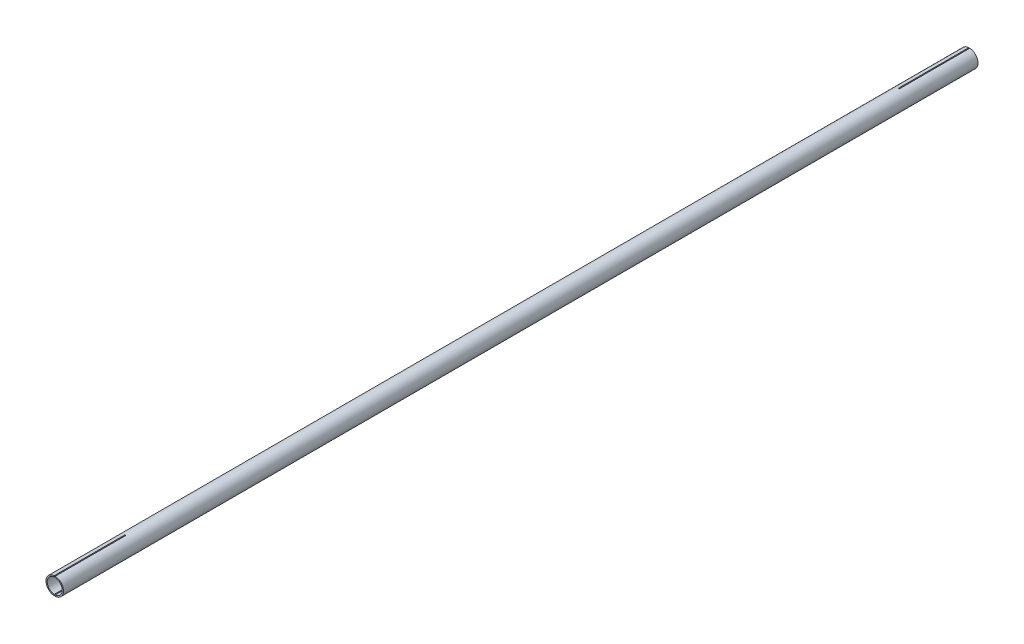
ISO-10303-21;
HEADER;
FILE_DESCRIPTION(('STEP AP214'),'2;1');
FILE_NAME('part.step','',(''),(''),'','','');
FILE_SCHEMA(('AUTOMOTIVE_DESIGN { 1 0 10303 214 1 1 1 1 }'));
ENDSEC;
DATA;
#1=APPLICATION_CONTEXT('core data for automotive mechanical design processes');
#2=APPLICATION_PROTOCOL_DEFINITION('international standard','automotive_design',2000,#1);
#3=PRODUCT_CONTEXT('',#1,'mechanical');
#4=PRODUCT('Part','Part','',(#3));
#5=PRODUCT_RELATED_PRODUCT_CATEGORY('part','',(#4));
#6=PRODUCT_DEFINITION_FORMATION('','',#4);
#7=PRODUCT_DEFINITION_CONTEXT('part definition',#1,'design');
#8=PRODUCT_DEFINITION('design','',#6,#7);
#9=PRODUCT_DEFINITION_SHAPE('','',#8);
#10=(LENGTH_UNIT() NAMED_UNIT(*) SI_UNIT(.MILLI.,.METRE.));
#11=(NAMED_UNIT(*) PLANE_ANGLE_UNIT() SI_UNIT($,.RADIAN.));
#12=(NAMED_UNIT(*) SI_UNIT($,.STERADIAN.) SOLID_ANGLE_UNIT());
#13=UNCERTAINTY_MEASURE_WITH_UNIT(LENGTH_MEASURE(1.E-05),#10,'distance_accuracy_value','');
#14=(GEOMETRIC_REPRESENTATION_CONTEXT(3) GLOBAL_UNCERTAINTY_ASSIGNED_CONTEXT((#13)) GLOBAL_UNIT_ASSIGNED_CONTEXT((#10,
#11,#12)) REPRESENTATION_CONTEXT('',''));
#15=CARTESIAN_POINT('',(0.,0.,0.));
#16=DIRECTION('',(0.,0.,1.));
#17=DIRECTION('',(1.,0.,0.));
#18=AXIS2_PLACEMENT_3D('',#15,#16,#17);
#19=CARTESIAN_POINT('',(0.,0.,1828.8));
#20=DIRECTION('',(0.,0.,1.));
#21=DIRECTION('',(1.,0.,0.));
#22=AXIS2_PLACEMENT_3D('',#19,#20,#21);
#23=PLANE('',#22);
#24=DIRECTION('',(0.,1.,0.));
#25=VECTOR('',#24,1.);
#26=CARTESIAN_POINT('',(1.04,0.,1828.8));
#27=LINE('',#26,#25);
#28=CARTESIAN_POINT('',(1.04,-17.4289988237994,1828.8));
#29=VERTEX_POINT('',#28);
#30=CARTESIAN_POINT('',(1.04,-14.9639032341164,1828.8));
#31=VERTEX_POINT('',#30);
#32=EDGE_CURVE('E224',#29,#31,#27,.T.);
#33=ORIENTED_EDGE('',*,*,#32,.F.);
#34=CARTESIAN_POINT('',(0.,0.,1828.8));
#35=DIRECTION('',(0.,0.,1.));
#36=DIRECTION('',(1.,0.,0.));
#37=AXIS2_PLACEMENT_3D('',#34,#35,#36);
#38=CIRCLE('',#37,17.46);
#39=CARTESIAN_POINT('',(1.04,17.4289988237994,1828.8));
#40=VERTEX_POINT('',#39);
#41=EDGE_CURVE('E198',#29,#40,#38,.T.);
#42=ORIENTED_EDGE('',*,*,#41,.T.);
#43=CARTESIAN_POINT('',(1.04,14.9639032341164,1828.8));
#44=VERTEX_POINT('',#43);
#45=EDGE_CURVE('E166',#44,#40,#27,.T.);
#46=ORIENTED_EDGE('',*,*,#45,.F.);
#47=CARTESIAN_POINT('',(0.,0.,1828.8));
#48=DIRECTION('',(0.,0.,1.));
#49=DIRECTION('',(1.,0.,0.));
#50=AXIS2_PLACEMENT_3D('',#47,#48,#49);
#51=CIRCLE('',#50,15.);
#52=EDGE_CURVE('E181',#31,#44,#51,.T.);
#53=ORIENTED_EDGE('',*,*,#52,.F.);
#54=EDGE_LOOP('',(#33,#42,#46,#53));
#55=FACE_BOUND('',#54,.T.);
#56=ADVANCED_FACE('F43',(#55),#23,.T.);
#57=CARTESIAN_POINT('',(0.,0.,0.));
#58=DIRECTION('',(0.,0.,1.));
#59=DIRECTION('',(1.,0.,0.));
#60=AXIS2_PLACEMENT_3D('',#57,#58,#59);
#61=PLANE('',#60);
#62=DIRECTION('',(0.,-1.,0.));
#63=VECTOR('',#62,1.);
#64=CARTESIAN_POINT('',(-1.04,-25.,0.));
#65=LINE('',#64,#63);
#66=CARTESIAN_POINT('',(-1.04,-14.9639032341164,0.));
#67=VERTEX_POINT('',#66);
#68=CARTESIAN_POINT('',(-1.04,-17.4289988237994,0.));
#69=VERTEX_POINT('',#68);
#70=EDGE_CURVE('E287',#67,#69,#65,.T.);
#71=ORIENTED_EDGE('',*,*,#70,.T.);
#72=CARTESIAN_POINT('',(0.,0.,0.));
#73=DIRECTION('',(0.,0.,1.));
#74=DIRECTION('',(1.,0.,0.));
#75=AXIS2_PLACEMENT_3D('',#72,#73,#74);
#76=CIRCLE('',#75,17.46);
#77=CARTESIAN_POINT('',(-1.04,17.4289988237994,0.));
#78=VERTEX_POINT('',#77);
#79=EDGE_CURVE('E186',#78,#69,#76,.T.);
#80=ORIENTED_EDGE('',*,*,#79,.F.);
#81=CARTESIAN_POINT('',(-1.04,14.9639032341164,0.));
#82=VERTEX_POINT('',#81);
#83=EDGE_CURVE('E291',#78,#82,#65,.T.);
#84=ORIENTED_EDGE('',*,*,#83,.T.);
#85=CARTESIAN_POINT('',(0.,0.,0.));
#86=DIRECTION('',(0.,0.,1.));
#87=DIRECTION('',(1.,0.,0.));
#88=AXIS2_PLACEMENT_3D('',#85,#86,#87);
#89=CIRCLE('',#88,15.);
#90=EDGE_CURVE('E189',#82,#67,#89,.T.);
#91=ORIENTED_EDGE('',*,*,#90,.T.);
#92=EDGE_LOOP('',(#71,#80,#84,#91));
#93=FACE_BOUND('',#92,.T.);
#94=ADVANCED_FACE('F322',(#93),#61,.F.);
#95=DIRECTION('',(0.,1.,0.));
#96=VECTOR('',#95,1.);
#97=CARTESIAN_POINT('',(1.04,-25.,0.));
#98=LINE('',#97,#96);
#99=CARTESIAN_POINT('',(1.04,14.9639032341164,0.));
#100=VERTEX_POINT('',#99);
#101=CARTESIAN_POINT('',(1.04,17.4289988237994,0.));
#102=VERTEX_POINT('',#101);
#103=EDGE_CURVE('E292',#100,#102,#98,.T.);
#104=ORIENTED_EDGE('',*,*,#103,.T.);
#105=CARTESIAN_POINT('',(1.04,-17.4289988237994,0.));
#106=VERTEX_POINT('',#105);
#107=EDGE_CURVE('E180',#106,#102,#76,.T.);
#108=ORIENTED_EDGE('',*,*,#107,.F.);
#109=CARTESIAN_POINT('',(1.04,-14.9639032341164,0.));
#110=VERTEX_POINT('',#109);
#111=EDGE_CURVE('E281',#106,#110,#98,.T.);
#112=ORIENTED_EDGE('',*,*,#111,.T.);
#113=EDGE_CURVE('E194',#110,#100,#89,.T.);
#114=ORIENTED_EDGE('',*,*,#113,.T.);
#115=EDGE_LOOP('',(#104,#108,#112,#114));
#116=FACE_BOUND('',#115,.T.);
#117=ADVANCED_FACE('F377',(#116),#61,.F.);
#118=CARTESIAN_POINT('',(0.,0.,1828.8));
#119=DIRECTION('',(0.,0.,-1.));
#120=DIRECTION('',(-1.,0.,0.));
#121=AXIS2_PLACEMENT_3D('',#118,#119,#120);
#122=CYLINDRICAL_SURFACE('',#121,17.46);
#123=CARTESIAN_POINT('',(0.,0.,1687.8));
#124=DIRECTION('',(0.,0.,1.));
#125=DIRECTION('',(1.,0.,0.));
#126=AXIS2_PLACEMENT_3D('',#123,#124,#125);
#127=CIRCLE('',#126,17.46);
#128=CARTESIAN_POINT('',(1.04,17.4289988237994,1687.8));
#129=VERTEX_POINT('',#128);
#130=CARTESIAN_POINT('',(-1.04,17.4289988237994,1687.8));
#131=VERTEX_POINT('',#130);
#132=EDGE_CURVE('E275',#129,#131,#127,.T.);
#133=ORIENTED_EDGE('',*,*,#132,.F.);
#134=DIRECTION('',(0.,0.,-1.));
#135=VECTOR('',#134,1.);
#136=CARTESIAN_POINT('',(1.04,17.4289988237994,1828.8));
#137=LINE('',#136,#135);
#138=EDGE_CURVE('E265',#129,#40,#137,.F.);
#139=ORIENTED_EDGE('',*,*,#138,.T.);
#140=ORIENTED_EDGE('',*,*,#41,.F.);
#141=DIRECTION('',(0.,0.,-1.));
#142=VECTOR('',#141,1.);
#143=CARTESIAN_POINT('',(1.04,-17.4289988237994,1828.8));
#144=LINE('',#143,#142);
#145=CARTESIAN_POINT('',(1.04,-17.4289988237994,1687.8));
#146=VERTEX_POINT('',#145);
#147=EDGE_CURVE('E268',#29,#146,#144,.T.);
#148=ORIENTED_EDGE('',*,*,#147,.T.);
#149=CARTESIAN_POINT('',(-1.04,-17.4289988237994,1687.8));
#150=VERTEX_POINT('',#149);
#151=EDGE_CURVE('E272',#150,#146,#127,.T.);
#152=ORIENTED_EDGE('',*,*,#151,.F.);
#153=DIRECTION('',(0.,0.,-1.));
#154=VECTOR('',#153,1.);
#155=CARTESIAN_POINT('',(-1.04,-17.4289988237994,1828.8));
#156=LINE('',#155,#154);
#157=CARTESIAN_POINT('',(-1.04,-17.4289988237994,1828.8));
#158=VERTEX_POINT('',#157);
#159=EDGE_CURVE('E176',#150,#158,#156,.F.);
#160=ORIENTED_EDGE('',*,*,#159,.T.);
#161=CARTESIAN_POINT('',(-1.04,17.4289988237994,1828.8));
#162=VERTEX_POINT('',#161);
#163=EDGE_CURVE('E201',#162,#158,#38,.T.);
#164=ORIENTED_EDGE('',*,*,#163,.F.);
#165=DIRECTION('',(0.,0.,-1.));
#166=VECTOR('',#165,1.);
#167=CARTESIAN_POINT('',(-1.04,17.4289988237994,1828.8));
#168=LINE('',#167,#166);
#169=EDGE_CURVE('E67',#162,#131,#168,.T.);
#170=ORIENTED_EDGE('',*,*,#169,.T.);
#171=EDGE_LOOP('',(#133,#139,#140,#148,#152,#160,#164,#170));
#172=FACE_BOUND('',#171,.T.);
#173=DIRECTION('',(0.,0.,-1.));
#174=VECTOR('',#173,1.);
#175=CARTESIAN_POINT('',(-1.04,17.4289988237994,1828.8));
#176=LINE('',#175,#174);
#177=CARTESIAN_POINT('',(-1.04,17.4289988237994,141.));
#178=VERTEX_POINT('',#177);
#179=EDGE_CURVE('E306',#78,#178,#176,.F.);
#180=ORIENTED_EDGE('',*,*,#179,.F.);
#181=ORIENTED_EDGE('',*,*,#79,.T.);
#182=DIRECTION('',(0.,0.,-1.));
#183=VECTOR('',#182,1.);
#184=CARTESIAN_POINT('',(-1.04,-17.4289988237994,1828.8));
#185=LINE('',#184,#183);
#186=CARTESIAN_POINT('',(-1.04,-17.4289988237994,141.));
#187=VERTEX_POINT('',#186);
#188=EDGE_CURVE('E192',#187,#69,#185,.T.);
#189=ORIENTED_EDGE('',*,*,#188,.F.);
#190=CARTESIAN_POINT('',(0.,0.,141.));
#191=DIRECTION('',(0.,0.,1.));
#192=DIRECTION('',(1.,0.,0.));
#193=AXIS2_PLACEMENT_3D('',#190,#191,#192);
#194=CIRCLE('',#193,17.46);
#195=CARTESIAN_POINT('',(1.04,-17.4289988237994,141.));
#196=VERTEX_POINT('',#195);
#197=EDGE_CURVE('E296',#187,#196,#194,.T.);
#198=ORIENTED_EDGE('',*,*,#197,.T.);
#199=DIRECTION('',(0.,0.,-1.));
#200=VECTOR('',#199,1.);
#201=CARTESIAN_POINT('',(1.04,-17.4289988237994,1828.8));
#202=LINE('',#201,#200);
#203=EDGE_CURVE('E301',#106,#196,#202,.F.);
#204=ORIENTED_EDGE('',*,*,#203,.F.);
#205=ORIENTED_EDGE('',*,*,#107,.T.);
#206=DIRECTION('',(0.,0.,-1.));
#207=VECTOR('',#206,1.);
#208=CARTESIAN_POINT('',(1.04,17.4289988237994,1828.8));
#209=LINE('',#208,#207);
#210=CARTESIAN_POINT('',(1.04,17.4289988237994,141.));
#211=VERTEX_POINT('',#210);
#212=EDGE_CURVE('E304',#211,#102,#209,.T.);
#213=ORIENTED_EDGE('',*,*,#212,.F.);
#214=EDGE_CURVE('E300',#211,#178,#194,.T.);
#215=ORIENTED_EDGE('',*,*,#214,.T.);
#216=EDGE_LOOP('',(#180,#181,#189,#198,#204,#205,#213,#215));
#217=FACE_BOUND('',#216,.T.);
#218=ADVANCED_FACE('F45',(#172,#217),#122,.T.);
#219=CARTESIAN_POINT('',(0.,0.,1828.8));
#220=DIRECTION('',(0.,0.,-1.));
#221=DIRECTION('',(-1.,0.,0.));
#222=AXIS2_PLACEMENT_3D('',#219,#220,#221);
#223=CYLINDRICAL_SURFACE('',#222,15.);
#224=DIRECTION('',(0.,0.,-1.));
#225=VECTOR('',#224,1.);
#226=CARTESIAN_POINT('',(1.04,14.9639032341164,1828.8));
#227=LINE('',#226,#225);
#228=CARTESIAN_POINT('',(1.04,14.9639032341164,1687.8));
#229=VERTEX_POINT('',#228);
#230=EDGE_CURVE('E260',#229,#44,#227,.F.);
#231=ORIENTED_EDGE('',*,*,#230,.F.);
#232=CARTESIAN_POINT('',(0.,0.,1687.8));
#233=DIRECTION('',(0.,0.,1.));
#234=DIRECTION('',(1.,0.,0.));
#235=AXIS2_PLACEMENT_3D('',#232,#233,#234);
#236=CIRCLE('',#235,15.);
#237=CARTESIAN_POINT('',(-1.04,14.9639032341164,1687.8));
#238=VERTEX_POINT('',#237);
#239=EDGE_CURVE('E11',#229,#238,#236,.T.);
#240=ORIENTED_EDGE('',*,*,#239,.T.);
#241=DIRECTION('',(0.,0.,-1.));
#242=VECTOR('',#241,1.);
#243=CARTESIAN_POINT('',(-1.04,14.9639032341164,1828.8));
#244=LINE('',#243,#242);
#245=CARTESIAN_POINT('',(-1.04,14.9639032341164,1828.8));
#246=VERTEX_POINT('',#245);
#247=EDGE_CURVE('E159',#246,#238,#244,.T.);
#248=ORIENTED_EDGE('',*,*,#247,.F.);
#249=CARTESIAN_POINT('',(-1.04,-14.9639032341164,1828.8));
#250=VERTEX_POINT('',#249);
#251=EDGE_CURVE('E174',#246,#250,#51,.T.);
#252=ORIENTED_EDGE('',*,*,#251,.T.);
#253=DIRECTION('',(0.,0.,-1.));
#254=VECTOR('',#253,1.);
#255=CARTESIAN_POINT('',(-1.04,-14.9639032341164,1828.8));
#256=LINE('',#255,#254);
#257=CARTESIAN_POINT('',(-1.04,-14.9639032341164,1687.8));
#258=VERTEX_POINT('',#257);
#259=EDGE_CURVE('E59',#258,#250,#256,.F.);
#260=ORIENTED_EDGE('',*,*,#259,.F.);
#261=CARTESIAN_POINT('',(1.04,-14.9639032341164,1687.8));
#262=VERTEX_POINT('',#261);
#263=EDGE_CURVE('E47',#258,#262,#236,.T.);
#264=ORIENTED_EDGE('',*,*,#263,.T.);
#265=DIRECTION('',(0.,0.,-1.));
#266=VECTOR('',#265,1.);
#267=CARTESIAN_POINT('',(1.04,-14.9639032341164,1828.8));
#268=LINE('',#267,#266);
#269=EDGE_CURVE('E234',#31,#262,#268,.T.);
#270=ORIENTED_EDGE('',*,*,#269,.F.);
#271=ORIENTED_EDGE('',*,*,#52,.T.);
#272=EDGE_LOOP('',(#231,#240,#248,#252,#260,#264,#270,#271));
#273=FACE_BOUND('',#272,.T.);
#274=ORIENTED_EDGE('',*,*,#90,.F.);
#275=DIRECTION('',(0.,0.,-1.));
#276=VECTOR('',#275,1.);
#277=CARTESIAN_POINT('',(-1.04,14.9639032341164,1828.8));
#278=LINE('',#277,#276);
#279=CARTESIAN_POINT('',(-1.04,14.9639032341164,141.));
#280=VERTEX_POINT('',#279);
#281=EDGE_CURVE('E219',#82,#280,#278,.F.);
#282=ORIENTED_EDGE('',*,*,#281,.T.);
#283=CARTESIAN_POINT('',(0.,0.,141.));
#284=DIRECTION('',(0.,0.,1.));
#285=DIRECTION('',(1.,0.,0.));
#286=AXIS2_PLACEMENT_3D('',#283,#284,#285);
#287=CIRCLE('',#286,15.);
#288=CARTESIAN_POINT('',(1.04,14.9639032341164,141.));
#289=VERTEX_POINT('',#288);
#290=EDGE_CURVE('E207',#289,#280,#287,.T.);
#291=ORIENTED_EDGE('',*,*,#290,.F.);
#292=DIRECTION('',(0.,0.,-1.));
#293=VECTOR('',#292,1.);
#294=CARTESIAN_POINT('',(1.04,14.9639032341164,1828.8));
#295=LINE('',#294,#293);
#296=EDGE_CURVE('E215',#289,#100,#295,.T.);
#297=ORIENTED_EDGE('',*,*,#296,.T.);
#298=ORIENTED_EDGE('',*,*,#113,.F.);
#299=DIRECTION('',(0.,0.,-1.));
#300=VECTOR('',#299,1.);
#301=CARTESIAN_POINT('',(1.04,-14.9639032341164,1828.8));
#302=LINE('',#301,#300);
#303=CARTESIAN_POINT('',(1.04,-14.9639032341164,141.));
#304=VERTEX_POINT('',#303);
#305=EDGE_CURVE('E206',#110,#304,#302,.F.);
#306=ORIENTED_EDGE('',*,*,#305,.T.);
#307=CARTESIAN_POINT('',(-1.04,-14.9639032341164,141.));
#308=VERTEX_POINT('',#307);
#309=EDGE_CURVE('E203',#308,#304,#287,.T.);
#310=ORIENTED_EDGE('',*,*,#309,.F.);
#311=DIRECTION('',(0.,0.,-1.));
#312=VECTOR('',#311,1.);
#313=CARTESIAN_POINT('',(-1.04,-14.9639032341164,1828.8));
#314=LINE('',#313,#312);
#315=EDGE_CURVE('E211',#308,#67,#314,.T.);
#316=ORIENTED_EDGE('',*,*,#315,.T.);
#317=EDGE_LOOP('',(#274,#282,#291,#297,#298,#306,#310,#316));
#318=FACE_BOUND('',#317,.T.);
#319=ADVANCED_FACE('F172',(#273,#318),#223,.F.);
#320=DIRECTION('',(0.,-1.,0.));
#321=VECTOR('',#320,1.);
#322=CARTESIAN_POINT('',(-1.04,0.,1828.8));
#323=LINE('',#322,#321);
#324=EDGE_CURVE('E156',#162,#246,#323,.T.);
#325=ORIENTED_EDGE('',*,*,#324,.F.);
#326=ORIENTED_EDGE('',*,*,#163,.T.);
#327=EDGE_CURVE('E167',#250,#158,#323,.T.);
#328=ORIENTED_EDGE('',*,*,#327,.F.);
#329=ORIENTED_EDGE('',*,*,#251,.F.);
#330=EDGE_LOOP('',(#325,#326,#328,#329));
#331=FACE_BOUND('',#330,.T.);
#332=ADVANCED_FACE('F178',(#331),#23,.T.);
#333=CARTESIAN_POINT('',(0.,0.,141.));
#334=DIRECTION('',(0.,0.,1.));
#335=DIRECTION('',(1.,0.,0.));
#336=AXIS2_PLACEMENT_3D('',#333,#334,#335);
#337=PLANE('',#336);
#338=DIRECTION('',(0.,-1.,0.));
#339=VECTOR('',#338,1.);
#340=CARTESIAN_POINT('',(-1.04,-25.,141.));
#341=LINE('',#340,#339);
#342=EDGE_CURVE('E276',#308,#187,#341,.T.);
#343=ORIENTED_EDGE('',*,*,#342,.F.);
#344=ORIENTED_EDGE('',*,*,#309,.T.);
#345=DIRECTION('',(0.,1.,0.));
#346=VECTOR('',#345,1.);
#347=CARTESIAN_POINT('',(1.04,-25.,141.));
#348=LINE('',#347,#346);
#349=EDGE_CURVE('E286',#196,#304,#348,.T.);
#350=ORIENTED_EDGE('',*,*,#349,.F.);
#351=ORIENTED_EDGE('',*,*,#197,.F.);
#352=EDGE_LOOP('',(#343,#344,#350,#351));
#353=FACE_BOUND('',#352,.T.);
#354=ADVANCED_FACE('F341',(#353),#337,.F.);
#355=CARTESIAN_POINT('',(1.04,-25.,141.));
#356=DIRECTION('',(-1.,0.,0.));
#357=DIRECTION('',(0.,0.,1.));
#358=AXIS2_PLACEMENT_3D('',#355,#356,#357);
#359=PLANE('',#358);
#360=ORIENTED_EDGE('',*,*,#203,.T.);
#361=ORIENTED_EDGE('',*,*,#349,.T.);
#362=ORIENTED_EDGE('',*,*,#305,.F.);
#363=ORIENTED_EDGE('',*,*,#111,.F.);
#364=EDGE_LOOP('',(#360,#361,#362,#363));
#365=FACE_BOUND('',#364,.T.);
#366=ADVANCED_FACE('F343',(#365),#359,.T.);
#367=CARTESIAN_POINT('',(-1.04,-25.,141.));
#368=DIRECTION('',(1.,0.,0.));
#369=DIRECTION('',(0.,0.,-1.));
#370=AXIS2_PLACEMENT_3D('',#367,#368,#369);
#371=PLANE('',#370);
#372=ORIENTED_EDGE('',*,*,#188,.T.);
#373=ORIENTED_EDGE('',*,*,#70,.F.);
#374=ORIENTED_EDGE('',*,*,#315,.F.);
#375=ORIENTED_EDGE('',*,*,#342,.T.);
#376=EDGE_LOOP('',(#372,#373,#374,#375));
#377=FACE_BOUND('',#376,.T.);
#378=ADVANCED_FACE('F315',(#377),#371,.T.);
#379=ORIENTED_EDGE('',*,*,#179,.T.);
#380=EDGE_CURVE('E280',#178,#280,#341,.T.);
#381=ORIENTED_EDGE('',*,*,#380,.T.);
#382=ORIENTED_EDGE('',*,*,#281,.F.);
#383=ORIENTED_EDGE('',*,*,#83,.F.);
#384=EDGE_LOOP('',(#379,#381,#382,#383));
#385=FACE_BOUND('',#384,.T.);
#386=ADVANCED_FACE('F333',(#385),#371,.T.);
#387=ORIENTED_EDGE('',*,*,#212,.T.);
#388=ORIENTED_EDGE('',*,*,#103,.F.);
#389=ORIENTED_EDGE('',*,*,#296,.F.);
#390=EDGE_CURVE('E282',#289,#211,#348,.T.);
#391=ORIENTED_EDGE('',*,*,#390,.T.);
#392=EDGE_LOOP('',(#387,#388,#389,#391));
#393=FACE_BOUND('',#392,.T.);
#394=ADVANCED_FACE('F390',(#393),#359,.T.);
#395=ORIENTED_EDGE('',*,*,#390,.F.);
#396=ORIENTED_EDGE('',*,*,#290,.T.);
#397=ORIENTED_EDGE('',*,*,#380,.F.);
#398=ORIENTED_EDGE('',*,*,#214,.F.);
#399=EDGE_LOOP('',(#395,#396,#397,#398));
#400=FACE_BOUND('',#399,.T.);
#401=ADVANCED_FACE('F331',(#400),#337,.F.);
#402=CARTESIAN_POINT('',(1.04,25.,1687.8));
#403=DIRECTION('',(1.,0.,0.));
#404=DIRECTION('',(0.,1.,0.));
#405=AXIS2_PLACEMENT_3D('',#402,#403,#404);
#406=PLANE('',#405);
#407=ORIENTED_EDGE('',*,*,#32,.T.);
#408=ORIENTED_EDGE('',*,*,#269,.T.);
#409=DIRECTION('',(0.,1.,0.));
#410=VECTOR('',#409,1.);
#411=CARTESIAN_POINT('',(1.04,25.,1687.8));
#412=LINE('',#411,#410);
#413=EDGE_CURVE('E243',#146,#262,#412,.T.);
#414=ORIENTED_EDGE('',*,*,#413,.F.);
#415=ORIENTED_EDGE('',*,*,#147,.F.);
#416=EDGE_LOOP('',(#407,#408,#414,#415));
#417=FACE_BOUND('',#416,.T.);
#418=ADVANCED_FACE('F358',(#417),#406,.F.);
#419=CARTESIAN_POINT('',(-1.04,25.,1687.8));
#420=DIRECTION('',(-1.,0.,0.));
#421=DIRECTION('',(0.,-1.,0.));
#422=AXIS2_PLACEMENT_3D('',#419,#420,#421);
#423=PLANE('',#422);
#424=DIRECTION('',(0.,-1.,0.));
#425=VECTOR('',#424,1.);
#426=CARTESIAN_POINT('',(-1.04,25.,1687.8));
#427=LINE('',#426,#425);
#428=EDGE_CURVE('E240',#258,#150,#427,.T.);
#429=ORIENTED_EDGE('',*,*,#428,.F.);
#430=ORIENTED_EDGE('',*,*,#259,.T.);
#431=ORIENTED_EDGE('',*,*,#327,.T.);
#432=ORIENTED_EDGE('',*,*,#159,.F.);
#433=EDGE_LOOP('',(#429,#430,#431,#432));
#434=FACE_BOUND('',#433,.T.);
#435=ADVANCED_FACE('F244',(#434),#423,.F.);
#436=CARTESIAN_POINT('',(0.,0.,1687.8));
#437=DIRECTION('',(0.,0.,1.));
#438=DIRECTION('',(1.,0.,0.));
#439=AXIS2_PLACEMENT_3D('',#436,#437,#438);
#440=PLANE('',#439);
#441=ORIENTED_EDGE('',*,*,#151,.T.);
#442=ORIENTED_EDGE('',*,*,#413,.T.);
#443=ORIENTED_EDGE('',*,*,#263,.F.);
#444=ORIENTED_EDGE('',*,*,#428,.T.);
#445=EDGE_LOOP('',(#441,#442,#443,#444));
#446=FACE_BOUND('',#445,.T.);
#447=ADVANCED_FACE('F239',(#446),#440,.T.);
#448=ORIENTED_EDGE('',*,*,#132,.T.);
#449=EDGE_CURVE('E247',#131,#238,#427,.T.);
#450=ORIENTED_EDGE('',*,*,#449,.T.);
#451=ORIENTED_EDGE('',*,*,#239,.F.);
#452=EDGE_CURVE('E251',#229,#129,#412,.T.);
#453=ORIENTED_EDGE('',*,*,#452,.T.);
#454=EDGE_LOOP('',(#448,#450,#451,#453));
#455=FACE_BOUND('',#454,.T.);
#456=ADVANCED_FACE('F354',(#455),#440,.T.);
#457=ORIENTED_EDGE('',*,*,#452,.F.);
#458=ORIENTED_EDGE('',*,*,#230,.T.);
#459=ORIENTED_EDGE('',*,*,#45,.T.);
#460=ORIENTED_EDGE('',*,*,#138,.F.);
#461=EDGE_LOOP('',(#457,#458,#459,#460));
#462=FACE_BOUND('',#461,.T.);
#463=ADVANCED_FACE('F360',(#462),#406,.F.);
#464=ORIENTED_EDGE('',*,*,#324,.T.);
#465=ORIENTED_EDGE('',*,*,#247,.T.);
#466=ORIENTED_EDGE('',*,*,#449,.F.);
#467=ORIENTED_EDGE('',*,*,#169,.F.);
#468=EDGE_LOOP('',(#464,#465,#466,#467));
#469=FACE_BOUND('',#468,.T.);
#470=ADVANCED_FACE('F158',(#469),#423,.F.);
#471=CLOSED_SHELL('',(#56,#94,#117,#218,#319,#332,#354,#366,#378,#386,#394,#401,#418,#435,#447,
#456,#463,#470));
#472=MANIFOLD_SOLID_BREP('B2',#471);
#473=ADVANCED_BREP_SHAPE_REPRESENTATION('',(#18,#472),#14);
#474=SHAPE_DEFINITION_REPRESENTATION(#9,#473);
ENDSEC;
END-ISO-10303-21;
